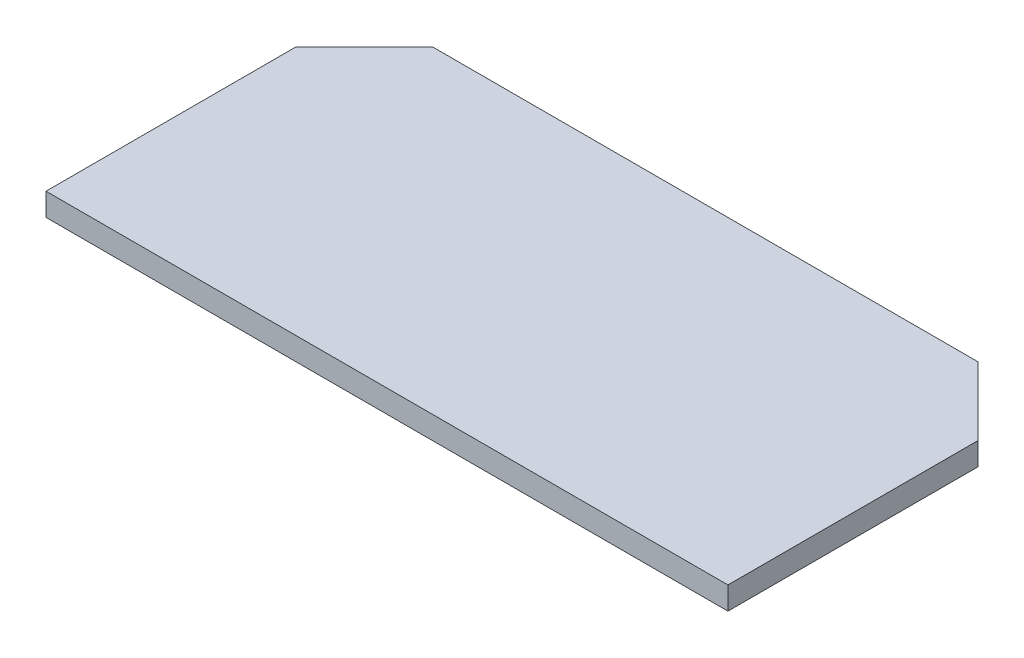
ISO-10303-21;
HEADER;
FILE_DESCRIPTION(('STEP AP214'),'2;1');
FILE_NAME('part.step','',(''),(''),'','','');
FILE_SCHEMA(('AUTOMOTIVE_DESIGN { 1 0 10303 214 1 1 1 1 }'));
ENDSEC;
DATA;
#1=APPLICATION_CONTEXT('core data for automotive mechanical design processes');
#2=APPLICATION_PROTOCOL_DEFINITION('international standard','automotive_design',2000,#1);
#3=PRODUCT_CONTEXT('',#1,'mechanical');
#4=PRODUCT('Part','Part','',(#3));
#5=PRODUCT_RELATED_PRODUCT_CATEGORY('part','',(#4));
#6=PRODUCT_DEFINITION_FORMATION('','',#4);
#7=PRODUCT_DEFINITION_CONTEXT('part definition',#1,'design');
#8=PRODUCT_DEFINITION('design','',#6,#7);
#9=PRODUCT_DEFINITION_SHAPE('','',#8);
#10=(LENGTH_UNIT() NAMED_UNIT(*) SI_UNIT(.MILLI.,.METRE.));
#11=(NAMED_UNIT(*) PLANE_ANGLE_UNIT() SI_UNIT($,.RADIAN.));
#12=(NAMED_UNIT(*) SI_UNIT($,.STERADIAN.) SOLID_ANGLE_UNIT());
#13=UNCERTAINTY_MEASURE_WITH_UNIT(LENGTH_MEASURE(1.E-05),#10,'distance_accuracy_value','');
#14=(GEOMETRIC_REPRESENTATION_CONTEXT(3) GLOBAL_UNCERTAINTY_ASSIGNED_CONTEXT((#13)) GLOBAL_UNIT_ASSIGNED_CONTEXT((#10,
#11,#12)) REPRESENTATION_CONTEXT('',''));
#15=CARTESIAN_POINT('',(0.,0.,0.));
#16=DIRECTION('',(0.,0.,1.));
#17=DIRECTION('',(1.,0.,0.));
#18=AXIS2_PLACEMENT_3D('',#15,#16,#17);
#19=CARTESIAN_POINT('',(95.25,-6.35000000000052,19.0500000000001));
#20=DIRECTION('',(1.,0.,0.));
#21=DIRECTION('',(0.,0.,-1.));
#22=AXIS2_PLACEMENT_3D('',#19,#20,#21);
#23=PLANE('',#22);
#24=DIRECTION('',(0.,0.,-1.));
#25=VECTOR('',#24,1.);
#26=CARTESIAN_POINT('',(95.25,0.,19.0500000000002));
#27=LINE('',#26,#25);
#28=CARTESIAN_POINT('',(95.25,-3.33066907387547E-13,88.9000000000003));
#29=VERTEX_POINT('',#28);
#30=CARTESIAN_POINT('',(95.25,0.,19.0500000000002));
#31=VERTEX_POINT('',#30);
#32=EDGE_CURVE('E88',#29,#31,#27,.T.);
#33=ORIENTED_EDGE('',*,*,#32,.F.);
#34=DIRECTION('',(0.,1.,0.));
#35=VECTOR('',#34,1.);
#36=CARTESIAN_POINT('',(95.25,-6.35000000000085,88.9000000000003));
#37=LINE('',#36,#35);
#38=CARTESIAN_POINT('',(95.25,-6.35000000000085,88.9000000000003));
#39=VERTEX_POINT('',#38);
#40=EDGE_CURVE('E11',#39,#29,#37,.T.);
#41=ORIENTED_EDGE('',*,*,#40,.F.);
#42=DIRECTION('',(0.,0.,-1.));
#43=VECTOR('',#42,1.);
#44=CARTESIAN_POINT('',(95.25,-6.35000000000052,19.0500000000001));
#45=LINE('',#44,#43);
#46=CARTESIAN_POINT('',(95.25,-6.35000000000052,19.0500000000001));
#47=VERTEX_POINT('',#46);
#48=EDGE_CURVE('E90',#39,#47,#45,.T.);
#49=ORIENTED_EDGE('',*,*,#48,.T.);
#50=DIRECTION('',(0.,1.,0.));
#51=VECTOR('',#50,1.);
#52=CARTESIAN_POINT('',(95.25,-6.35000000000052,19.0500000000001));
#53=LINE('',#52,#51);
#54=EDGE_CURVE('E39',#47,#31,#53,.T.);
#55=ORIENTED_EDGE('',*,*,#54,.T.);
#56=EDGE_LOOP('',(#33,#41,#49,#55));
#57=FACE_BOUND('',#56,.T.);
#58=ADVANCED_FACE('F36',(#57),#23,.T.);
#59=CARTESIAN_POINT('',(-95.25,-6.35000000000085,88.9000000000003));
#60=DIRECTION('',(0.,0.,1.));
#61=DIRECTION('',(1.,0.,0.));
#62=AXIS2_PLACEMENT_3D('',#59,#60,#61);
#63=PLANE('',#62);
#64=DIRECTION('',(1.,0.,0.));
#65=VECTOR('',#64,1.);
#66=CARTESIAN_POINT('',(-95.25,-3.33066907387547E-13,88.9000000000003));
#67=LINE('',#66,#65);
#68=CARTESIAN_POINT('',(-95.25,-3.33066907387547E-13,88.9000000000003));
#69=VERTEX_POINT('',#68);
#70=EDGE_CURVE('E106',#69,#29,#67,.T.);
#71=ORIENTED_EDGE('',*,*,#70,.F.);
#72=DIRECTION('',(0.,1.,0.));
#73=VECTOR('',#72,1.);
#74=CARTESIAN_POINT('',(-95.25,-6.35000000000085,88.9000000000003));
#75=LINE('',#74,#73);
#76=CARTESIAN_POINT('',(-95.25,-6.35000000000085,88.9000000000003));
#77=VERTEX_POINT('',#76);
#78=EDGE_CURVE('E44',#77,#69,#75,.T.);
#79=ORIENTED_EDGE('',*,*,#78,.F.);
#80=DIRECTION('',(1.,0.,0.));
#81=VECTOR('',#80,1.);
#82=CARTESIAN_POINT('',(-95.25,-6.35000000000085,88.9000000000003));
#83=LINE('',#82,#81);
#84=EDGE_CURVE('E95',#77,#39,#83,.T.);
#85=ORIENTED_EDGE('',*,*,#84,.T.);
#86=ORIENTED_EDGE('',*,*,#40,.T.);
#87=EDGE_LOOP('',(#71,#79,#85,#86));
#88=FACE_BOUND('',#87,.T.);
#89=ADVANCED_FACE('F141',(#88),#63,.T.);
#90=CARTESIAN_POINT('',(-95.25,-6.35000000000052,19.0500000000001));
#91=DIRECTION('',(-1.,0.,0.));
#92=DIRECTION('',(0.,0.,1.));
#93=AXIS2_PLACEMENT_3D('',#90,#91,#92);
#94=PLANE('',#93);
#95=DIRECTION('',(0.,0.,1.));
#96=VECTOR('',#95,1.);
#97=CARTESIAN_POINT('',(-95.25,0.,19.0500000000002));
#98=LINE('',#97,#96);
#99=CARTESIAN_POINT('',(-95.25,0.,19.0500000000002));
#100=VERTEX_POINT('',#99);
#101=EDGE_CURVE('E113',#100,#69,#98,.T.);
#102=ORIENTED_EDGE('',*,*,#101,.F.);
#103=DIRECTION('',(0.,1.,0.));
#104=VECTOR('',#103,1.);
#105=CARTESIAN_POINT('',(-95.25,-6.35000000000052,19.0500000000001));
#106=LINE('',#105,#104);
#107=CARTESIAN_POINT('',(-95.25,-6.35000000000052,19.0500000000001));
#108=VERTEX_POINT('',#107);
#109=EDGE_CURVE('E129',#108,#100,#106,.T.);
#110=ORIENTED_EDGE('',*,*,#109,.F.);
#111=DIRECTION('',(0.,0.,1.));
#112=VECTOR('',#111,1.);
#113=CARTESIAN_POINT('',(-95.25,-6.35000000000052,19.0500000000001));
#114=LINE('',#113,#112);
#115=EDGE_CURVE('E125',#108,#77,#114,.T.);
#116=ORIENTED_EDGE('',*,*,#115,.T.);
#117=ORIENTED_EDGE('',*,*,#78,.T.);
#118=EDGE_LOOP('',(#102,#110,#116,#117));
#119=FACE_BOUND('',#118,.T.);
#120=ADVANCED_FACE('F146',(#119),#94,.T.);
#121=CARTESIAN_POINT('',(-95.25,-6.35000000000052,19.0500000000001));
#122=DIRECTION('',(-0.707106781186548,0.,-0.70710678118655));
#123=DIRECTION('',(-0.707106781186547,0.,0.70710678118655));
#124=AXIS2_PLACEMENT_3D('',#121,#122,#123);
#125=PLANE('',#124);
#126=DIRECTION('',(-0.707106781186547,0.,0.70710678118655));
#127=VECTOR('',#126,1.);
#128=CARTESIAN_POINT('',(-95.25,0.,19.0500000000002));
#129=LINE('',#128,#127);
#130=CARTESIAN_POINT('',(-76.2,0.,0.));
#131=VERTEX_POINT('',#130);
#132=EDGE_CURVE('E110',#131,#100,#129,.T.);
#133=ORIENTED_EDGE('',*,*,#132,.F.);
#134=DIRECTION('',(0.,1.,0.));
#135=VECTOR('',#134,1.);
#136=CARTESIAN_POINT('',(-76.2,-6.35000000000052,0.));
#137=LINE('',#136,#135);
#138=CARTESIAN_POINT('',(-76.2,-6.35000000000052,0.));
#139=VERTEX_POINT('',#138);
#140=EDGE_CURVE('E131',#139,#131,#137,.T.);
#141=ORIENTED_EDGE('',*,*,#140,.F.);
#142=DIRECTION('',(-0.707106781186547,0.,0.70710678118655));
#143=VECTOR('',#142,1.);
#144=CARTESIAN_POINT('',(-95.25,-6.35000000000052,19.0500000000001));
#145=LINE('',#144,#143);
#146=EDGE_CURVE('E122',#139,#108,#145,.T.);
#147=ORIENTED_EDGE('',*,*,#146,.T.);
#148=ORIENTED_EDGE('',*,*,#109,.T.);
#149=EDGE_LOOP('',(#133,#141,#147,#148));
#150=FACE_BOUND('',#149,.T.);
#151=ADVANCED_FACE('F138',(#150),#125,.T.);
#152=CARTESIAN_POINT('',(-76.2,-6.35000000000052,0.));
#153=DIRECTION('',(0.,0.,-1.));
#154=DIRECTION('',(-1.,0.,0.));
#155=AXIS2_PLACEMENT_3D('',#152,#153,#154);
#156=PLANE('',#155);
#157=DIRECTION('',(-1.,0.,0.));
#158=VECTOR('',#157,1.);
#159=CARTESIAN_POINT('',(-76.2,0.,0.));
#160=LINE('',#159,#158);
#161=CARTESIAN_POINT('',(76.2,0.,0.));
#162=VERTEX_POINT('',#161);
#163=EDGE_CURVE('E102',#162,#131,#160,.T.);
#164=ORIENTED_EDGE('',*,*,#163,.F.);
#165=DIRECTION('',(0.,1.,0.));
#166=VECTOR('',#165,1.);
#167=CARTESIAN_POINT('',(76.2,-6.35000000000052,0.));
#168=LINE('',#167,#166);
#169=CARTESIAN_POINT('',(76.2,-6.35000000000052,0.));
#170=VERTEX_POINT('',#169);
#171=EDGE_CURVE('E94',#170,#162,#168,.T.);
#172=ORIENTED_EDGE('',*,*,#171,.F.);
#173=DIRECTION('',(-1.,0.,0.));
#174=VECTOR('',#173,1.);
#175=CARTESIAN_POINT('',(-76.2,-6.35000000000052,0.));
#176=LINE('',#175,#174);
#177=EDGE_CURVE('E119',#170,#139,#176,.T.);
#178=ORIENTED_EDGE('',*,*,#177,.T.);
#179=ORIENTED_EDGE('',*,*,#140,.T.);
#180=EDGE_LOOP('',(#164,#172,#178,#179));
#181=FACE_BOUND('',#180,.T.);
#182=ADVANCED_FACE('F134',(#181),#156,.T.);
#183=CARTESIAN_POINT('',(76.2,-6.35000000000052,0.));
#184=DIRECTION('',(0.707106781186547,0.,-0.70710678118655));
#185=DIRECTION('',(-0.707106781186548,0.,-0.70710678118655));
#186=AXIS2_PLACEMENT_3D('',#183,#184,#185);
#187=PLANE('',#186);
#188=DIRECTION('',(-0.707106781186548,0.,-0.70710678118655));
#189=VECTOR('',#188,1.);
#190=CARTESIAN_POINT('',(76.2,0.,0.));
#191=LINE('',#190,#189);
#192=EDGE_CURVE('E97',#31,#162,#191,.T.);
#193=ORIENTED_EDGE('',*,*,#192,.F.);
#194=ORIENTED_EDGE('',*,*,#54,.F.);
#195=DIRECTION('',(-0.707106781186548,0.,-0.70710678118655));
#196=VECTOR('',#195,1.);
#197=CARTESIAN_POINT('',(76.2,-6.35000000000052,0.));
#198=LINE('',#197,#196);
#199=EDGE_CURVE('E117',#47,#170,#198,.T.);
#200=ORIENTED_EDGE('',*,*,#199,.T.);
#201=ORIENTED_EDGE('',*,*,#171,.T.);
#202=EDGE_LOOP('',(#193,#194,#200,#201));
#203=FACE_BOUND('',#202,.T.);
#204=ADVANCED_FACE('F98',(#203),#187,.T.);
#205=CARTESIAN_POINT('',(95.25,-6.35000000000085,88.9000000000003));
#206=DIRECTION('',(0.,1.,0.));
#207=DIRECTION('',(0.,0.,1.));
#208=AXIS2_PLACEMENT_3D('',#205,#206,#207);
#209=PLANE('',#208);
#210=ORIENTED_EDGE('',*,*,#48,.F.);
#211=ORIENTED_EDGE('',*,*,#84,.F.);
#212=ORIENTED_EDGE('',*,*,#115,.F.);
#213=ORIENTED_EDGE('',*,*,#146,.F.);
#214=ORIENTED_EDGE('',*,*,#177,.F.);
#215=ORIENTED_EDGE('',*,*,#199,.F.);
#216=EDGE_LOOP('',(#210,#211,#212,#213,#214,#215));
#217=FACE_BOUND('',#216,.T.);
#218=ADVANCED_FACE('F145',(#217),#209,.F.);
#219=CARTESIAN_POINT('',(95.25,-3.33066907387547E-13,88.9000000000003));
#220=DIRECTION('',(0.,1.,0.));
#221=DIRECTION('',(0.,0.,1.));
#222=AXIS2_PLACEMENT_3D('',#219,#220,#221);
#223=PLANE('',#222);
#224=ORIENTED_EDGE('',*,*,#32,.T.);
#225=ORIENTED_EDGE('',*,*,#192,.T.);
#226=ORIENTED_EDGE('',*,*,#163,.T.);
#227=ORIENTED_EDGE('',*,*,#132,.T.);
#228=ORIENTED_EDGE('',*,*,#101,.T.);
#229=ORIENTED_EDGE('',*,*,#70,.T.);
#230=EDGE_LOOP('',(#224,#225,#226,#227,#228,#229));
#231=FACE_BOUND('',#230,.T.);
#232=ADVANCED_FACE('F104',(#231),#223,.T.);
#233=CLOSED_SHELL('',(#58,#89,#120,#151,#182,#204,#218,#232));
#234=MANIFOLD_SOLID_BREP('B2',#233);
#235=ADVANCED_BREP_SHAPE_REPRESENTATION('',(#18,#234),#14);
#236=SHAPE_DEFINITION_REPRESENTATION(#9,#235);
ENDSEC;
END-ISO-10303-21;
